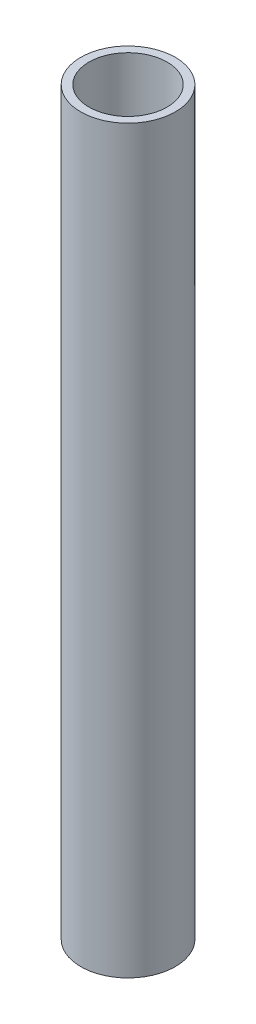
ISO-10303-21;
HEADER;
FILE_DESCRIPTION(('STEP AP214'),'2;1');
FILE_NAME('part.step','',(''),(''),'','','');
FILE_SCHEMA(('AUTOMOTIVE_DESIGN { 1 0 10303 214 1 1 1 1 }'));
ENDSEC;
DATA;
#1=APPLICATION_CONTEXT('core data for automotive mechanical design processes');
#2=APPLICATION_PROTOCOL_DEFINITION('international standard','automotive_design',2000,#1);
#3=PRODUCT_CONTEXT('',#1,'mechanical');
#4=PRODUCT('Part','Part','',(#3));
#5=PRODUCT_RELATED_PRODUCT_CATEGORY('part','',(#4));
#6=PRODUCT_DEFINITION_FORMATION('','',#4);
#7=PRODUCT_DEFINITION_CONTEXT('part definition',#1,'design');
#8=PRODUCT_DEFINITION('design','',#6,#7);
#9=PRODUCT_DEFINITION_SHAPE('','',#8);
#10=(LENGTH_UNIT() NAMED_UNIT(*) SI_UNIT(.MILLI.,.METRE.));
#11=(NAMED_UNIT(*) PLANE_ANGLE_UNIT() SI_UNIT($,.RADIAN.));
#12=(NAMED_UNIT(*) SI_UNIT($,.STERADIAN.) SOLID_ANGLE_UNIT());
#13=UNCERTAINTY_MEASURE_WITH_UNIT(LENGTH_MEASURE(1.E-05),#10,'distance_accuracy_value','');
#14=(GEOMETRIC_REPRESENTATION_CONTEXT(3) GLOBAL_UNCERTAINTY_ASSIGNED_CONTEXT((#13)) GLOBAL_UNIT_ASSIGNED_CONTEXT((#10,
#11,#12)) REPRESENTATION_CONTEXT('',''));
#15=CARTESIAN_POINT('',(0.,0.,0.));
#16=DIRECTION('',(0.,0.,1.));
#17=DIRECTION('',(1.,0.,0.));
#18=AXIS2_PLACEMENT_3D('',#15,#16,#17);
#19=CARTESIAN_POINT('',(0.,360.,0.));
#20=DIRECTION('',(0.,1.,0.));
#21=DIRECTION('',(0.,0.,1.));
#22=AXIS2_PLACEMENT_3D('',#19,#20,#21);
#23=PLANE('',#22);
#24=CARTESIAN_POINT('',(0.,360.,0.));
#25=DIRECTION('',(0.,1.,0.));
#26=DIRECTION('',(0.,0.,1.));
#27=AXIS2_PLACEMENT_3D('',#24,#25,#26);
#28=CIRCLE('',#27,23.);
#29=CARTESIAN_POINT('',(0.,360.,-23.));
#30=VERTEX_POINT('',#29);
#31=EDGE_CURVE('E10',#30,#30,#28,.T.);
#32=ORIENTED_EDGE('',*,*,#31,.T.);
#33=EDGE_LOOP('',(#32));
#34=FACE_BOUND('',#33,.T.);
#35=CARTESIAN_POINT('',(0.,360.,0.));
#36=DIRECTION('',(0.,1.,0.));
#37=DIRECTION('',(0.,0.,1.));
#38=AXIS2_PLACEMENT_3D('',#35,#36,#37);
#39=CIRCLE('',#38,19.);
#40=CARTESIAN_POINT('',(0.,360.,-19.));
#41=VERTEX_POINT('',#40);
#42=EDGE_CURVE('E42',#41,#41,#39,.T.);
#43=ORIENTED_EDGE('',*,*,#42,.F.);
#44=EDGE_LOOP('',(#43));
#45=FACE_BOUND('',#44,.T.);
#46=ADVANCED_FACE('F31',(#34,#45),#23,.T.);
#47=CARTESIAN_POINT('',(0.,0.,0.));
#48=DIRECTION('',(0.,1.,0.));
#49=DIRECTION('',(0.,0.,1.));
#50=AXIS2_PLACEMENT_3D('',#47,#48,#49);
#51=PLANE('',#50);
#52=CARTESIAN_POINT('',(0.,0.,0.));
#53=DIRECTION('',(0.,1.,0.));
#54=DIRECTION('',(0.,0.,1.));
#55=AXIS2_PLACEMENT_3D('',#52,#53,#54);
#56=CIRCLE('',#55,23.);
#57=CARTESIAN_POINT('',(0.,0.,-23.));
#58=VERTEX_POINT('',#57);
#59=EDGE_CURVE('E35',#58,#58,#56,.T.);
#60=ORIENTED_EDGE('',*,*,#59,.F.);
#61=EDGE_LOOP('',(#60));
#62=FACE_BOUND('',#61,.T.);
#63=CARTESIAN_POINT('',(0.,0.,0.));
#64=DIRECTION('',(0.,1.,0.));
#65=DIRECTION('',(0.,0.,1.));
#66=AXIS2_PLACEMENT_3D('',#63,#64,#65);
#67=CIRCLE('',#66,19.);
#68=CARTESIAN_POINT('',(0.,0.,-19.));
#69=VERTEX_POINT('',#68);
#70=EDGE_CURVE('E44',#69,#69,#67,.T.);
#71=ORIENTED_EDGE('',*,*,#70,.T.);
#72=EDGE_LOOP('',(#71));
#73=FACE_BOUND('',#72,.T.);
#74=ADVANCED_FACE('F54',(#62,#73),#51,.F.);
#75=CARTESIAN_POINT('',(0.,360.,0.));
#76=DIRECTION('',(0.,-1.,0.));
#77=DIRECTION('',(0.,0.,-1.));
#78=AXIS2_PLACEMENT_3D('',#75,#76,#77);
#79=CYLINDRICAL_SURFACE('',#78,23.);
#80=CARTESIAN_POINT('',(0.,360.,-23.));
#81=CARTESIAN_POINT('',(0.,356.25,-23.));
#82=CARTESIAN_POINT('',(0.,352.5,-23.));
#83=CARTESIAN_POINT('',(0.,345.,-23.));
#84=CARTESIAN_POINT('',(0.,341.25,-23.));
#85=CARTESIAN_POINT('',(0.,333.75,-23.));
#86=CARTESIAN_POINT('',(0.,330.,-23.));
#87=CARTESIAN_POINT('',(0.,322.5,-23.));
#88=CARTESIAN_POINT('',(0.,318.75,-23.));
#89=CARTESIAN_POINT('',(0.,311.25,-23.));
#90=CARTESIAN_POINT('',(0.,307.5,-23.));
#91=CARTESIAN_POINT('',(0.,300.,-23.));
#92=CARTESIAN_POINT('',(0.,296.25,-23.));
#93=CARTESIAN_POINT('',(0.,288.75,-23.));
#94=CARTESIAN_POINT('',(0.,285.,-23.));
#95=CARTESIAN_POINT('',(0.,277.5,-23.));
#96=CARTESIAN_POINT('',(0.,273.75,-23.));
#97=CARTESIAN_POINT('',(0.,266.25,-23.));
#98=CARTESIAN_POINT('',(0.,262.5,-23.));
#99=CARTESIAN_POINT('',(0.,255.,-23.));
#100=CARTESIAN_POINT('',(0.,251.25,-23.));
#101=CARTESIAN_POINT('',(0.,243.75,-23.));
#102=CARTESIAN_POINT('',(0.,240.,-23.));
#103=CARTESIAN_POINT('',(0.,232.5,-23.));
#104=CARTESIAN_POINT('',(0.,228.75,-23.));
#105=CARTESIAN_POINT('',(0.,221.25,-23.));
#106=CARTESIAN_POINT('',(0.,217.5,-23.));
#107=CARTESIAN_POINT('',(0.,210.,-23.));
#108=CARTESIAN_POINT('',(0.,206.25,-23.));
#109=CARTESIAN_POINT('',(0.,198.75,-23.));
#110=CARTESIAN_POINT('',(0.,195.,-23.));
#111=CARTESIAN_POINT('',(0.,187.5,-23.));
#112=CARTESIAN_POINT('',(0.,183.75,-23.));
#113=CARTESIAN_POINT('',(0.,176.25,-23.));
#114=CARTESIAN_POINT('',(0.,172.5,-23.));
#115=CARTESIAN_POINT('',(0.,165.,-23.));
#116=CARTESIAN_POINT('',(0.,161.25,-23.));
#117=CARTESIAN_POINT('',(0.,153.75,-23.));
#118=CARTESIAN_POINT('',(0.,150.,-23.));
#119=CARTESIAN_POINT('',(0.,142.5,-23.));
#120=CARTESIAN_POINT('',(0.,138.75,-23.));
#121=CARTESIAN_POINT('',(0.,131.25,-23.));
#122=CARTESIAN_POINT('',(0.,127.5,-23.));
#123=CARTESIAN_POINT('',(0.,120.,-23.));
#124=CARTESIAN_POINT('',(0.,116.25,-23.));
#125=CARTESIAN_POINT('',(0.,108.75,-23.));
#126=CARTESIAN_POINT('',(0.,105.,-23.));
#127=CARTESIAN_POINT('',(0.,97.5,-23.));
#128=CARTESIAN_POINT('',(0.,93.75,-23.));
#129=CARTESIAN_POINT('',(0.,86.25,-23.));
#130=CARTESIAN_POINT('',(0.,82.5,-23.));
#131=CARTESIAN_POINT('',(0.,75.,-23.));
#132=CARTESIAN_POINT('',(0.,71.25,-23.));
#133=CARTESIAN_POINT('',(0.,63.75,-23.));
#134=CARTESIAN_POINT('',(0.,60.,-23.));
#135=CARTESIAN_POINT('',(0.,52.5,-23.));
#136=CARTESIAN_POINT('',(0.,48.75,-23.));
#137=CARTESIAN_POINT('',(0.,41.25,-23.));
#138=CARTESIAN_POINT('',(0.,37.5,-23.));
#139=CARTESIAN_POINT('',(0.,30.,-23.));
#140=CARTESIAN_POINT('',(0.,26.25,-23.));
#141=CARTESIAN_POINT('',(0.,18.75,-23.));
#142=CARTESIAN_POINT('',(0.,14.9999999999999,-23.));
#143=CARTESIAN_POINT('',(0.,7.49999999999993,-23.));
#144=CARTESIAN_POINT('',(0.,3.74999999999994,-23.));
#145=CARTESIAN_POINT('',(0.,0.,-23.));
#146=B_SPLINE_CURVE_WITH_KNOTS('',3,(#80,#81,#82,#83,#84,#85,#86,#87,#88,#89,#90,#91,#92,#93,
#94,#95,#96,#97,#98,#99,#100,#101,#102,#103,#104,#105,#106,#107,#108,#109,#110,#111,#112,#113,
#114,#115,#116,#117,#118,#119,#120,#121,#122,#123,#124,#125,#126,#127,#128,#129,#130,#131,#132,
#133,#134,#135,#136,#137,#138,#139,#140,#141,#142,#143,#144,#145),.UNSPECIFIED.,.F.,.F.,(4,2,2,
2,2,2,2,2,2,2,2,2,2,2,2,2,2,2,2,2,2,2,2,2,2,2,2,2,2,2,2,2,4),(0.,11.25,22.5,33.7500000000001,
45.,56.25,67.5,78.75,90.,101.25,112.5,123.75,135.,146.25,157.5,168.75,180.,191.25,202.5,213.75,
225.,236.25,247.5,258.75,270.,281.25,292.5,303.75,315.,326.25,337.5,348.75,360.),.UNSPECIFIED.);
#147=EDGE_CURVE('BSEAM33',#30,#58,#146,.T.);
#148=ORIENTED_EDGE('',*,*,#31,.F.);
#149=ORIENTED_EDGE('',*,*,#59,.T.);
#150=ORIENTED_EDGE('',*,*,#147,.T.);
#151=ORIENTED_EDGE('',*,*,#147,.F.);
#152=EDGE_LOOP('',(#148,#150,#149,#151));
#153=FACE_BOUND('',#152,.T.);
#154=ADVANCED_FACE('F33',(#153),#79,.T.);
#155=CARTESIAN_POINT('',(0.,360.,0.));
#156=DIRECTION('',(0.,-1.,0.));
#157=DIRECTION('',(0.,0.,-1.));
#158=AXIS2_PLACEMENT_3D('',#155,#156,#157);
#159=CYLINDRICAL_SURFACE('',#158,19.);
#160=CARTESIAN_POINT('',(0.,360.,-19.));
#161=CARTESIAN_POINT('',(0.,356.25,-19.));
#162=CARTESIAN_POINT('',(0.,352.5,-19.));
#163=CARTESIAN_POINT('',(0.,345.,-19.));
#164=CARTESIAN_POINT('',(0.,341.25,-19.));
#165=CARTESIAN_POINT('',(0.,333.75,-19.));
#166=CARTESIAN_POINT('',(0.,330.,-19.));
#167=CARTESIAN_POINT('',(0.,322.5,-19.));
#168=CARTESIAN_POINT('',(0.,318.75,-19.));
#169=CARTESIAN_POINT('',(0.,311.25,-19.));
#170=CARTESIAN_POINT('',(0.,307.5,-19.));
#171=CARTESIAN_POINT('',(0.,300.,-19.));
#172=CARTESIAN_POINT('',(0.,296.25,-19.));
#173=CARTESIAN_POINT('',(0.,288.75,-19.));
#174=CARTESIAN_POINT('',(0.,285.,-19.));
#175=CARTESIAN_POINT('',(0.,277.5,-19.));
#176=CARTESIAN_POINT('',(0.,273.75,-19.));
#177=CARTESIAN_POINT('',(0.,266.25,-19.));
#178=CARTESIAN_POINT('',(0.,262.5,-19.));
#179=CARTESIAN_POINT('',(0.,255.,-19.));
#180=CARTESIAN_POINT('',(0.,251.25,-19.));
#181=CARTESIAN_POINT('',(0.,243.75,-19.));
#182=CARTESIAN_POINT('',(0.,240.,-19.));
#183=CARTESIAN_POINT('',(0.,232.5,-19.));
#184=CARTESIAN_POINT('',(0.,228.75,-19.));
#185=CARTESIAN_POINT('',(0.,221.25,-19.));
#186=CARTESIAN_POINT('',(0.,217.5,-19.));
#187=CARTESIAN_POINT('',(0.,210.,-19.));
#188=CARTESIAN_POINT('',(0.,206.25,-19.));
#189=CARTESIAN_POINT('',(0.,198.75,-19.));
#190=CARTESIAN_POINT('',(0.,195.,-19.));
#191=CARTESIAN_POINT('',(0.,187.5,-19.));
#192=CARTESIAN_POINT('',(0.,183.75,-19.));
#193=CARTESIAN_POINT('',(0.,176.25,-19.));
#194=CARTESIAN_POINT('',(0.,172.5,-19.));
#195=CARTESIAN_POINT('',(0.,165.,-19.));
#196=CARTESIAN_POINT('',(0.,161.25,-19.));
#197=CARTESIAN_POINT('',(0.,153.75,-19.));
#198=CARTESIAN_POINT('',(0.,150.,-19.));
#199=CARTESIAN_POINT('',(0.,142.5,-19.));
#200=CARTESIAN_POINT('',(0.,138.75,-19.));
#201=CARTESIAN_POINT('',(0.,131.25,-19.));
#202=CARTESIAN_POINT('',(0.,127.5,-19.));
#203=CARTESIAN_POINT('',(0.,120.,-19.));
#204=CARTESIAN_POINT('',(0.,116.25,-19.));
#205=CARTESIAN_POINT('',(0.,108.75,-19.));
#206=CARTESIAN_POINT('',(0.,105.,-19.));
#207=CARTESIAN_POINT('',(0.,97.5,-19.));
#208=CARTESIAN_POINT('',(0.,93.75,-19.));
#209=CARTESIAN_POINT('',(0.,86.25,-19.));
#210=CARTESIAN_POINT('',(0.,82.4999999999999,-19.));
#211=CARTESIAN_POINT('',(0.,74.9999999999999,-19.));
#212=CARTESIAN_POINT('',(0.,71.2499999999999,-19.));
#213=CARTESIAN_POINT('',(0.,63.75,-19.));
#214=CARTESIAN_POINT('',(0.,60.,-19.));
#215=CARTESIAN_POINT('',(0.,52.5,-19.));
#216=CARTESIAN_POINT('',(0.,48.7499999999999,-19.));
#217=CARTESIAN_POINT('',(0.,41.2499999999999,-19.));
#218=CARTESIAN_POINT('',(0.,37.4999999999999,-19.));
#219=CARTESIAN_POINT('',(0.,30.,-19.));
#220=CARTESIAN_POINT('',(0.,26.25,-19.));
#221=CARTESIAN_POINT('',(0.,18.75,-19.));
#222=CARTESIAN_POINT('',(0.,14.9999999999999,-19.));
#223=CARTESIAN_POINT('',(0.,7.49999999999993,-19.));
#224=CARTESIAN_POINT('',(0.,3.74999999999994,-19.));
#225=CARTESIAN_POINT('',(0.,0.,-19.));
#226=B_SPLINE_CURVE_WITH_KNOTS('',3,(#160,#161,#162,#163,#164,#165,#166,#167,#168,#169,#170,
#171,#172,#173,#174,#175,#176,#177,#178,#179,#180,#181,#182,#183,#184,#185,#186,#187,#188,#189,
#190,#191,#192,#193,#194,#195,#196,#197,#198,#199,#200,#201,#202,#203,#204,#205,#206,#207,#208,
#209,#210,#211,#212,#213,#214,#215,#216,#217,#218,#219,#220,#221,#222,#223,#224,#225),
.UNSPECIFIED.,.F.,.F.,(4,2,2,2,2,2,2,2,2,2,2,2,2,2,2,2,2,2,2,2,2,2,2,2,2,2,2,2,2,2,2,2,4),(0.,
11.25,22.5,33.7499999999999,45.,56.25,67.4999999999999,78.75,90.,101.25,112.5,123.75,135.,
146.25,157.5,168.75,180.,191.25,202.5,213.75,225.,236.25,247.5,258.75,270.,281.25,292.5,303.75,
315.,326.25,337.5,348.75,360.),.UNSPECIFIED.);
#227=EDGE_CURVE('BSEAM50',#41,#69,#226,.T.);
#228=ORIENTED_EDGE('',*,*,#42,.T.);
#229=ORIENTED_EDGE('',*,*,#70,.F.);
#230=ORIENTED_EDGE('',*,*,#227,.T.);
#231=ORIENTED_EDGE('',*,*,#227,.F.);
#232=EDGE_LOOP('',(#228,#230,#229,#231));
#233=FACE_BOUND('',#232,.T.);
#234=ADVANCED_FACE('F50',(#233),#159,.F.);
#235=CLOSED_SHELL('',(#46,#74,#154,#234));
#236=MANIFOLD_SOLID_BREP('B2',#235);
#237=ADVANCED_BREP_SHAPE_REPRESENTATION('',(#18,#236),#14);
#238=SHAPE_DEFINITION_REPRESENTATION(#9,#237);
ENDSEC;
END-ISO-10303-21;
